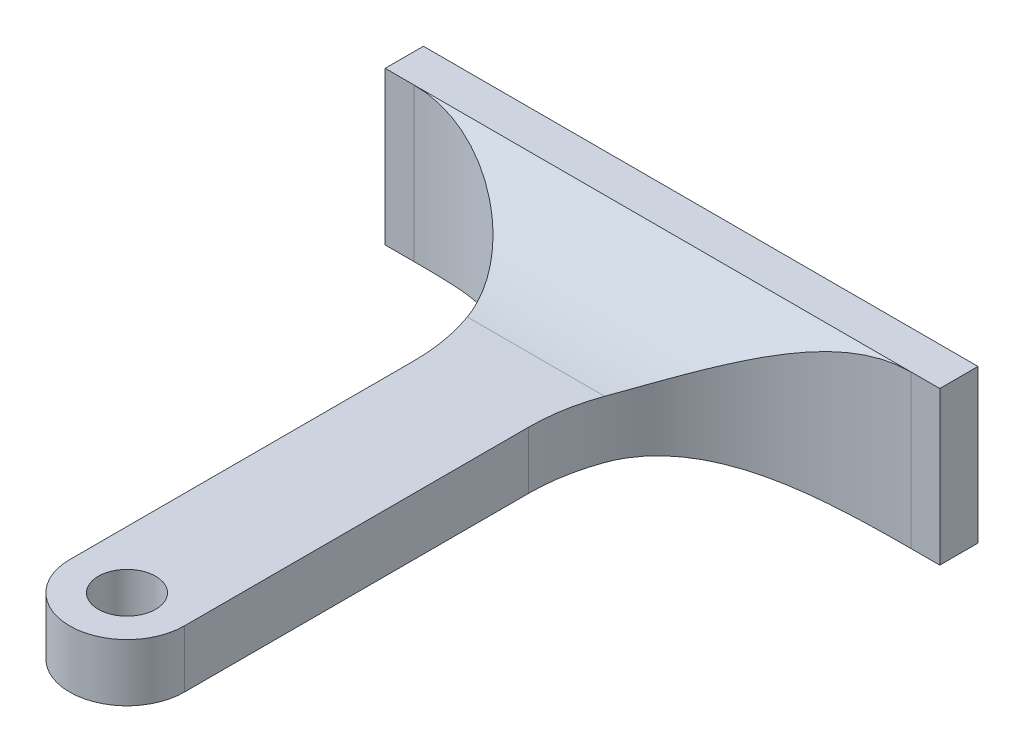
ISO-10303-21;
HEADER;
FILE_DESCRIPTION(('STEP AP214'),'2;1');
FILE_NAME('part.step','',(''),(''),'','','');
FILE_SCHEMA(('AUTOMOTIVE_DESIGN { 1 0 10303 214 1 1 1 1 }'));
ENDSEC;
DATA;
#1=APPLICATION_CONTEXT('core data for automotive mechanical design processes');
#2=APPLICATION_PROTOCOL_DEFINITION('international standard','automotive_design',2000,#1);
#3=PRODUCT_CONTEXT('',#1,'mechanical');
#4=PRODUCT('Part','Part','',(#3));
#5=PRODUCT_RELATED_PRODUCT_CATEGORY('part','',(#4));
#6=PRODUCT_DEFINITION_FORMATION('','',#4);
#7=PRODUCT_DEFINITION_CONTEXT('part definition',#1,'design');
#8=PRODUCT_DEFINITION('design','',#6,#7);
#9=PRODUCT_DEFINITION_SHAPE('','',#8);
#10=(LENGTH_UNIT() NAMED_UNIT(*) SI_UNIT(.MILLI.,.METRE.));
#11=(NAMED_UNIT(*) PLANE_ANGLE_UNIT() SI_UNIT($,.RADIAN.));
#12=(NAMED_UNIT(*) SI_UNIT($,.STERADIAN.) SOLID_ANGLE_UNIT());
#13=UNCERTAINTY_MEASURE_WITH_UNIT(LENGTH_MEASURE(1.E-05),#10,'distance_accuracy_value','');
#14=(GEOMETRIC_REPRESENTATION_CONTEXT(3) GLOBAL_UNCERTAINTY_ASSIGNED_CONTEXT((#13)) GLOBAL_UNIT_ASSIGNED_CONTEXT((#10,
#11,#12)) REPRESENTATION_CONTEXT('',''));
#15=CARTESIAN_POINT('',(0.,0.,0.));
#16=DIRECTION('',(0.,0.,1.));
#17=DIRECTION('',(1.,0.,0.));
#18=AXIS2_PLACEMENT_3D('',#15,#16,#17);
#19=CARTESIAN_POINT('',(0.,0.,2.));
#20=DIRECTION('',(0.,0.,-1.));
#21=DIRECTION('',(-1.,0.,0.));
#22=AXIS2_PLACEMENT_3D('',#19,#20,#21);
#23=PLANE('',#22);
#24=DIRECTION('',(1.,0.,0.));
#25=VECTOR('',#24,1.);
#26=CARTESIAN_POINT('',(-14.5,-4.,2.));
#27=LINE('',#26,#25);
#28=CARTESIAN_POINT('',(-14.5,-4.,2.));
#29=VERTEX_POINT('',#28);
#30=CARTESIAN_POINT('',(-13.,-4.,2.));
#31=VERTEX_POINT('',#30);
#32=EDGE_CURVE('E195',#29,#31,#27,.T.);
#33=ORIENTED_EDGE('',*,*,#32,.T.);
#34=DIRECTION('',(0.,-1.,0.));
#35=VECTOR('',#34,1.);
#36=CARTESIAN_POINT('',(-13.,1.5,2.));
#37=LINE('',#36,#35);
#38=CARTESIAN_POINT('',(-13.,4.,2.));
#39=VERTEX_POINT('',#38);
#40=EDGE_CURVE('E233',#31,#39,#37,.F.);
#41=ORIENTED_EDGE('',*,*,#40,.T.);
#42=DIRECTION('',(-1.,0.,0.));
#43=VECTOR('',#42,1.);
#44=CARTESIAN_POINT('',(-14.5,4.,2.));
#45=LINE('',#44,#43);
#46=CARTESIAN_POINT('',(-14.5,4.,2.));
#47=VERTEX_POINT('',#46);
#48=EDGE_CURVE('E191',#39,#47,#45,.T.);
#49=ORIENTED_EDGE('',*,*,#48,.T.);
#50=DIRECTION('',(0.,-1.,0.));
#51=VECTOR('',#50,1.);
#52=CARTESIAN_POINT('',(-14.5,4.,2.));
#53=LINE('',#52,#51);
#54=EDGE_CURVE('E189',#47,#29,#53,.T.);
#55=ORIENTED_EDGE('',*,*,#54,.T.);
#56=EDGE_LOOP('',(#33,#41,#49,#55));
#57=FACE_BOUND('',#56,.T.);
#58=ADVANCED_FACE('F39',(#57),#23,.F.);
#59=CARTESIAN_POINT('',(-14.5,4.,2.));
#60=DIRECTION('',(0.,-1.,0.));
#61=DIRECTION('',(0.,0.,-1.));
#62=AXIS2_PLACEMENT_3D('',#59,#60,#61);
#63=PLANE('',#62);
#64=DIRECTION('',(-1.,0.,0.));
#65=VECTOR('',#64,1.);
#66=CARTESIAN_POINT('',(-14.5,4.,0.));
#67=LINE('',#66,#65);
#68=CARTESIAN_POINT('',(14.5,4.,0.));
#69=VERTEX_POINT('',#68);
#70=CARTESIAN_POINT('',(-14.5,4.,0.));
#71=VERTEX_POINT('',#70);
#72=EDGE_CURVE('E175',#69,#71,#67,.T.);
#73=ORIENTED_EDGE('',*,*,#72,.T.);
#74=DIRECTION('',(0.,0.,-1.));
#75=VECTOR('',#74,1.);
#76=CARTESIAN_POINT('',(-14.5,4.,2.));
#77=LINE('',#76,#75);
#78=EDGE_CURVE('E223',#47,#71,#77,.T.);
#79=ORIENTED_EDGE('',*,*,#78,.F.);
#80=ORIENTED_EDGE('',*,*,#48,.F.);
#81=CARTESIAN_POINT('',(13.,4.,2.));
#82=VERTEX_POINT('',#81);
#83=EDGE_CURVE('E190',#82,#39,#45,.T.);
#84=ORIENTED_EDGE('',*,*,#83,.F.);
#85=CARTESIAN_POINT('',(14.5,4.,2.));
#86=VERTEX_POINT('',#85);
#87=EDGE_CURVE('E185',#86,#82,#45,.T.);
#88=ORIENTED_EDGE('',*,*,#87,.F.);
#89=DIRECTION('',(0.,0.,-1.));
#90=VECTOR('',#89,1.);
#91=CARTESIAN_POINT('',(14.5,4.,2.));
#92=LINE('',#91,#90);
#93=EDGE_CURVE('E202',#86,#69,#92,.T.);
#94=ORIENTED_EDGE('',*,*,#93,.T.);
#95=EDGE_LOOP('',(#73,#79,#80,#84,#88,#94));
#96=FACE_BOUND('',#95,.T.);
#97=ADVANCED_FACE('F324',(#96),#63,.F.);
#98=CARTESIAN_POINT('',(-14.5,4.,2.));
#99=DIRECTION('',(1.,0.,0.));
#100=DIRECTION('',(0.,1.,0.));
#101=AXIS2_PLACEMENT_3D('',#98,#99,#100);
#102=PLANE('',#101);
#103=DIRECTION('',(0.,-1.,0.));
#104=VECTOR('',#103,1.);
#105=CARTESIAN_POINT('',(-14.5,4.,0.));
#106=LINE('',#105,#104);
#107=CARTESIAN_POINT('',(-14.5,-4.,0.));
#108=VERTEX_POINT('',#107);
#109=EDGE_CURVE('E180',#71,#108,#106,.T.);
#110=ORIENTED_EDGE('',*,*,#109,.T.);
#111=DIRECTION('',(0.,0.,-1.));
#112=VECTOR('',#111,1.);
#113=CARTESIAN_POINT('',(-14.5,-4.,2.));
#114=LINE('',#113,#112);
#115=EDGE_CURVE('E219',#29,#108,#114,.T.);
#116=ORIENTED_EDGE('',*,*,#115,.F.);
#117=ORIENTED_EDGE('',*,*,#54,.F.);
#118=ORIENTED_EDGE('',*,*,#78,.T.);
#119=EDGE_LOOP('',(#110,#116,#117,#118));
#120=FACE_BOUND('',#119,.T.);
#121=ADVANCED_FACE('F331',(#120),#102,.F.);
#122=CARTESIAN_POINT('',(-14.5,-4.,2.));
#123=DIRECTION('',(0.,1.,0.));
#124=DIRECTION('',(-1.,0.,0.));
#125=AXIS2_PLACEMENT_3D('',#122,#123,#124);
#126=PLANE('',#125);
#127=DIRECTION('',(1.,0.,0.));
#128=VECTOR('',#127,1.);
#129=CARTESIAN_POINT('',(-14.5,-4.,0.));
#130=LINE('',#129,#128);
#131=CARTESIAN_POINT('',(14.5,-4.,0.));
#132=VERTEX_POINT('',#131);
#133=EDGE_CURVE('E206',#108,#132,#130,.T.);
#134=ORIENTED_EDGE('',*,*,#133,.T.);
#135=DIRECTION('',(0.,0.,-1.));
#136=VECTOR('',#135,1.);
#137=CARTESIAN_POINT('',(14.5,-4.,2.));
#138=LINE('',#137,#136);
#139=CARTESIAN_POINT('',(14.5,-4.,2.));
#140=VERTEX_POINT('',#139);
#141=EDGE_CURVE('E215',#140,#132,#138,.T.);
#142=ORIENTED_EDGE('',*,*,#141,.F.);
#143=CARTESIAN_POINT('',(13.,-4.,2.));
#144=VERTEX_POINT('',#143);
#145=EDGE_CURVE('E194',#144,#140,#27,.T.);
#146=ORIENTED_EDGE('',*,*,#145,.F.);
#147=EDGE_CURVE('E200',#31,#144,#27,.T.);
#148=ORIENTED_EDGE('',*,*,#147,.F.);
#149=ORIENTED_EDGE('',*,*,#32,.F.);
#150=ORIENTED_EDGE('',*,*,#115,.T.);
#151=EDGE_LOOP('',(#134,#142,#146,#148,#149,#150));
#152=FACE_BOUND('',#151,.T.);
#153=ADVANCED_FACE('F343',(#152),#126,.F.);
#154=CARTESIAN_POINT('',(14.5,4.,2.));
#155=DIRECTION('',(-1.,0.,0.));
#156=DIRECTION('',(0.,-1.,0.));
#157=AXIS2_PLACEMENT_3D('',#154,#155,#156);
#158=PLANE('',#157);
#159=DIRECTION('',(0.,1.,0.));
#160=VECTOR('',#159,1.);
#161=CARTESIAN_POINT('',(14.5,4.,0.));
#162=LINE('',#161,#160);
#163=EDGE_CURVE('E209',#132,#69,#162,.T.);
#164=ORIENTED_EDGE('',*,*,#163,.T.);
#165=ORIENTED_EDGE('',*,*,#93,.F.);
#166=DIRECTION('',(0.,1.,0.));
#167=VECTOR('',#166,1.);
#168=CARTESIAN_POINT('',(14.5,4.,2.));
#169=LINE('',#168,#167);
#170=EDGE_CURVE('E199',#140,#86,#169,.T.);
#171=ORIENTED_EDGE('',*,*,#170,.F.);
#172=ORIENTED_EDGE('',*,*,#141,.T.);
#173=EDGE_LOOP('',(#164,#165,#171,#172));
#174=FACE_BOUND('',#173,.T.);
#175=ADVANCED_FACE('F336',(#174),#158,.F.);
#176=ORIENTED_EDGE('',*,*,#87,.T.);
#177=DIRECTION('',(0.,-1.,0.));
#178=VECTOR('',#177,1.);
#179=CARTESIAN_POINT('',(13.,-1.5,2.));
#180=LINE('',#179,#178);
#181=EDGE_CURVE('E230',#82,#144,#180,.T.);
#182=ORIENTED_EDGE('',*,*,#181,.T.);
#183=ORIENTED_EDGE('',*,*,#145,.T.);
#184=ORIENTED_EDGE('',*,*,#170,.T.);
#185=EDGE_LOOP('',(#176,#182,#183,#184));
#186=FACE_BOUND('',#185,.T.);
#187=ADVANCED_FACE('F327',(#186),#23,.F.);
#188=CARTESIAN_POINT('',(0.,0.,0.));
#189=DIRECTION('',(0.,0.,-1.));
#190=DIRECTION('',(-1.,0.,0.));
#191=AXIS2_PLACEMENT_3D('',#188,#189,#190);
#192=PLANE('',#191);
#193=ORIENTED_EDGE('',*,*,#72,.F.);
#194=ORIENTED_EDGE('',*,*,#163,.F.);
#195=ORIENTED_EDGE('',*,*,#133,.F.);
#196=ORIENTED_EDGE('',*,*,#109,.F.);
#197=EDGE_LOOP('',(#193,#194,#195,#196));
#198=FACE_BOUND('',#197,.T.);
#199=ADVANCED_FACE('F269',(#198),#192,.T.);
#200=CARTESIAN_POINT('',(0.,1.5,30.));
#201=DIRECTION('',(0.,-1.,0.));
#202=DIRECTION('',(0.,0.,-1.));
#203=AXIS2_PLACEMENT_3D('',#200,#201,#202);
#204=PLANE('',#203);
#205=DIRECTION('',(0.,0.,-1.));
#206=VECTOR('',#205,1.);
#207=CARTESIAN_POINT('',(3.,1.5,2.));
#208=LINE('',#207,#206);
#209=CARTESIAN_POINT('',(3.,1.5,30.));
#210=VERTEX_POINT('',#209);
#211=CARTESIAN_POINT('',(3.,1.5,12.));
#212=VERTEX_POINT('',#211);
#213=EDGE_CURVE('E168',#210,#212,#208,.T.);
#214=ORIENTED_EDGE('',*,*,#213,.T.);
#215=CARTESIAN_POINT('',(13.,1.5,12.));
#216=DIRECTION('',(0.,-1.,0.));
#217=DIRECTION('',(0.,0.,-1.));
#218=AXIS2_PLACEMENT_3D('',#215,#216,#217);
#219=CIRCLE('',#218,10.);
#220=CARTESIAN_POINT('',(3.59055976408642,1.5,8.61437827766148));
#221=VERTEX_POINT('',#220);
#222=EDGE_CURVE('E68',#212,#221,#219,.T.);
#223=ORIENTED_EDGE('',*,*,#222,.T.);
#224=CARTESIAN_POINT('',(3.59055976408642,1.5,8.61437827766148));
#225=CARTESIAN_POINT('',(3.,1.5,8.61437827766148));
#226=B_SPLINE_CURVE_WITH_KNOTS('',1,(#224,#225),.UNSPECIFIED.,.F.,.F.,(2,2),(0.,1.),.UNSPECIFIED.);
#227=CARTESIAN_POINT('',(3.,1.5,8.61437827766147));
#228=VERTEX_POINT('',#227);
#229=EDGE_CURVE('E256',#221,#228,#226,.T.);
#230=ORIENTED_EDGE('',*,*,#229,.T.);
#231=DIRECTION('',(-1.,0.,0.));
#232=VECTOR('',#231,1.);
#233=CARTESIAN_POINT('',(0.,1.5,8.61437827766148));
#234=LINE('',#233,#232);
#235=CARTESIAN_POINT('',(-3.,1.5,8.61437827766148));
#236=VERTEX_POINT('',#235);
#237=EDGE_CURVE('E237',#228,#236,#234,.T.);
#238=ORIENTED_EDGE('',*,*,#237,.T.);
#239=CARTESIAN_POINT('',(-3.,1.5,8.61437827766148));
#240=CARTESIAN_POINT('',(-3.59055976408642,1.5,8.61437827766148));
#241=B_SPLINE_CURVE_WITH_KNOTS('',1,(#239,#240),.UNSPECIFIED.,.F.,.F.,(2,2),(0.,1.),.UNSPECIFIED.);
#242=CARTESIAN_POINT('',(-3.59055976408642,1.5,8.61437827766148));
#243=VERTEX_POINT('',#242);
#244=EDGE_CURVE('E251',#236,#243,#241,.T.);
#245=ORIENTED_EDGE('',*,*,#244,.T.);
#246=CARTESIAN_POINT('',(-13.,1.5,12.));
#247=DIRECTION('',(0.,-1.,0.));
#248=DIRECTION('',(0.,0.,-1.));
#249=AXIS2_PLACEMENT_3D('',#246,#247,#248);
#250=CIRCLE('',#249,10.);
#251=CARTESIAN_POINT('',(-3.,1.5,12.));
#252=VERTEX_POINT('',#251);
#253=EDGE_CURVE('E152',#243,#252,#250,.T.);
#254=ORIENTED_EDGE('',*,*,#253,.T.);
#255=DIRECTION('',(0.,0.,1.));
#256=VECTOR('',#255,1.);
#257=CARTESIAN_POINT('',(-3.,1.5,30.));
#258=LINE('',#257,#256);
#259=CARTESIAN_POINT('',(-3.,1.5,30.));
#260=VERTEX_POINT('',#259);
#261=EDGE_CURVE('E145',#252,#260,#258,.T.);
#262=ORIENTED_EDGE('',*,*,#261,.T.);
#263=CARTESIAN_POINT('',(0.,1.5,30.));
#264=DIRECTION('',(0.,1.,0.));
#265=DIRECTION('',(0.,0.,-1.));
#266=AXIS2_PLACEMENT_3D('',#263,#264,#265);
#267=CIRCLE('',#266,3.);
#268=EDGE_CURVE('E149',#260,#210,#267,.T.);
#269=ORIENTED_EDGE('',*,*,#268,.T.);
#270=EDGE_LOOP('',(#214,#223,#230,#238,#245,#254,#262,#269));
#271=FACE_BOUND('',#270,.T.);
#272=CARTESIAN_POINT('',(0.,1.5,30.));
#273=DIRECTION('',(0.,1.,0.));
#274=DIRECTION('',(0.,0.,1.));
#275=AXIS2_PLACEMENT_3D('',#272,#273,#274);
#276=CIRCLE('',#275,1.5);
#277=CARTESIAN_POINT('',(0.,1.5,31.5));
#278=VERTEX_POINT('',#277);
#279=EDGE_CURVE('E364',#278,#278,#276,.T.);
#280=ORIENTED_EDGE('',*,*,#279,.F.);
#281=EDGE_LOOP('',(#280));
#282=FACE_BOUND('',#281,.T.);
#283=ADVANCED_FACE('F147',(#271,#282),#204,.F.);
#284=CARTESIAN_POINT('',(0.,-1.5,30.));
#285=DIRECTION('',(0.,-1.,0.));
#286=DIRECTION('',(0.,0.,-1.));
#287=AXIS2_PLACEMENT_3D('',#284,#285,#286);
#288=PLANE('',#287);
#289=CARTESIAN_POINT('',(-13.,-1.5,12.));
#290=DIRECTION('',(0.,-1.,0.));
#291=DIRECTION('',(0.,0.,-1.));
#292=AXIS2_PLACEMENT_3D('',#289,#290,#291);
#293=CIRCLE('',#292,10.);
#294=CARTESIAN_POINT('',(-3.,-1.5,12.));
#295=VERTEX_POINT('',#294);
#296=CARTESIAN_POINT('',(-3.59055976408642,-1.5,8.61437827766148));
#297=VERTEX_POINT('',#296);
#298=EDGE_CURVE('E246',#295,#297,#293,.F.);
#299=ORIENTED_EDGE('',*,*,#298,.T.);
#300=CARTESIAN_POINT('',(-3.59055976408642,-1.5,8.61437827766148));
#301=CARTESIAN_POINT('',(-3.,-1.5,8.61437827766148));
#302=B_SPLINE_CURVE_WITH_KNOTS('',1,(#300,#301),.UNSPECIFIED.,.F.,.F.,(2,2),(0.,1.),.UNSPECIFIED.);
#303=CARTESIAN_POINT('',(-3.,-1.5,8.61437827766148));
#304=VERTEX_POINT('',#303);
#305=EDGE_CURVE('E54',#297,#304,#302,.T.);
#306=ORIENTED_EDGE('',*,*,#305,.T.);
#307=DIRECTION('',(-1.,0.,0.));
#308=VECTOR('',#307,1.);
#309=CARTESIAN_POINT('',(3.,-1.5,8.61437827766148));
#310=LINE('',#309,#308);
#311=CARTESIAN_POINT('',(3.,-1.5,8.61437827766147));
#312=VERTEX_POINT('',#311);
#313=EDGE_CURVE('E243',#304,#312,#310,.F.);
#314=ORIENTED_EDGE('',*,*,#313,.T.);
#315=CARTESIAN_POINT('',(3.,-1.5,8.61437827766148));
#316=CARTESIAN_POINT('',(3.59055976408642,-1.5,8.61437827766148));
#317=B_SPLINE_CURVE_WITH_KNOTS('',1,(#315,#316),.UNSPECIFIED.,.F.,.F.,(2,2),(0.,1.),.UNSPECIFIED.);
#318=CARTESIAN_POINT('',(3.59055976408642,-1.5,8.61437827766148));
#319=VERTEX_POINT('',#318);
#320=EDGE_CURVE('E11',#312,#319,#317,.T.);
#321=ORIENTED_EDGE('',*,*,#320,.T.);
#322=CARTESIAN_POINT('',(13.,-1.5,12.));
#323=DIRECTION('',(0.,-1.,0.));
#324=DIRECTION('',(0.,0.,-1.));
#325=AXIS2_PLACEMENT_3D('',#322,#323,#324);
#326=CIRCLE('',#325,10.);
#327=CARTESIAN_POINT('',(3.,-1.5,12.));
#328=VERTEX_POINT('',#327);
#329=EDGE_CURVE('E375',#319,#328,#326,.F.);
#330=ORIENTED_EDGE('',*,*,#329,.T.);
#331=DIRECTION('',(0.,0.,-1.));
#332=VECTOR('',#331,1.);
#333=CARTESIAN_POINT('',(3.,-1.5,2.));
#334=LINE('',#333,#332);
#335=CARTESIAN_POINT('',(3.,-1.5,30.));
#336=VERTEX_POINT('',#335);
#337=EDGE_CURVE('E158',#336,#328,#334,.T.);
#338=ORIENTED_EDGE('',*,*,#337,.F.);
#339=CARTESIAN_POINT('',(0.,-1.5,30.));
#340=DIRECTION('',(0.,1.,0.));
#341=DIRECTION('',(0.,0.,-1.));
#342=AXIS2_PLACEMENT_3D('',#339,#340,#341);
#343=CIRCLE('',#342,3.);
#344=CARTESIAN_POINT('',(-3.,-1.5,30.));
#345=VERTEX_POINT('',#344);
#346=EDGE_CURVE('E384',#345,#336,#343,.T.);
#347=ORIENTED_EDGE('',*,*,#346,.F.);
#348=DIRECTION('',(0.,0.,1.));
#349=VECTOR('',#348,1.);
#350=CARTESIAN_POINT('',(-3.,-1.5,30.));
#351=LINE('',#350,#349);
#352=EDGE_CURVE('E172',#295,#345,#351,.T.);
#353=ORIENTED_EDGE('',*,*,#352,.F.);
#354=EDGE_LOOP('',(#299,#306,#314,#321,#330,#338,#347,#353));
#355=FACE_BOUND('',#354,.T.);
#356=CARTESIAN_POINT('',(0.,-1.5,30.));
#357=DIRECTION('',(0.,1.,0.));
#358=DIRECTION('',(0.,0.,1.));
#359=AXIS2_PLACEMENT_3D('',#356,#357,#358);
#360=CIRCLE('',#359,1.5);
#361=CARTESIAN_POINT('',(0.,-1.5,31.5));
#362=VERTEX_POINT('',#361);
#363=EDGE_CURVE('E360',#362,#362,#360,.T.);
#364=ORIENTED_EDGE('',*,*,#363,.T.);
#365=EDGE_LOOP('',(#364));
#366=FACE_BOUND('',#365,.T.);
#367=ADVANCED_FACE('F268',(#355,#366),#288,.T.);
#368=CARTESIAN_POINT('',(-3.,1.5,30.));
#369=DIRECTION('',(1.,0.,0.));
#370=DIRECTION('',(0.,0.,-1.));
#371=AXIS2_PLACEMENT_3D('',#368,#369,#370);
#372=PLANE('',#371);
#373=ORIENTED_EDGE('',*,*,#261,.F.);
#374=DIRECTION('',(0.,-1.,0.));
#375=VECTOR('',#374,1.);
#376=CARTESIAN_POINT('',(-3.,-1.5,12.));
#377=LINE('',#376,#375);
#378=EDGE_CURVE('E227',#252,#295,#377,.T.);
#379=ORIENTED_EDGE('',*,*,#378,.T.);
#380=ORIENTED_EDGE('',*,*,#352,.T.);
#381=DIRECTION('',(0.,-1.,0.));
#382=VECTOR('',#381,1.);
#383=CARTESIAN_POINT('',(-3.,1.5,30.));
#384=LINE('',#383,#382);
#385=EDGE_CURVE('E163',#260,#345,#384,.T.);
#386=ORIENTED_EDGE('',*,*,#385,.F.);
#387=EDGE_LOOP('',(#373,#379,#380,#386));
#388=FACE_BOUND('',#387,.T.);
#389=ADVANCED_FACE('F170',(#388),#372,.F.);
#390=CARTESIAN_POINT('',(0.,1.5,30.));
#391=DIRECTION('',(0.,-1.,0.));
#392=DIRECTION('',(0.,0.,-1.));
#393=AXIS2_PLACEMENT_3D('',#390,#391,#392);
#394=CYLINDRICAL_SURFACE('',#393,3.);
#395=ORIENTED_EDGE('',*,*,#346,.T.);
#396=DIRECTION('',(0.,-1.,0.));
#397=VECTOR('',#396,1.);
#398=CARTESIAN_POINT('',(3.,1.5,30.));
#399=LINE('',#398,#397);
#400=EDGE_CURVE('E165',#210,#336,#399,.T.);
#401=ORIENTED_EDGE('',*,*,#400,.F.);
#402=ORIENTED_EDGE('',*,*,#268,.F.);
#403=ORIENTED_EDGE('',*,*,#385,.T.);
#404=EDGE_LOOP('',(#395,#401,#402,#403));
#405=FACE_BOUND('',#404,.T.);
#406=ADVANCED_FACE('F162',(#405),#394,.T.);
#407=CARTESIAN_POINT('',(3.,1.5,2.));
#408=DIRECTION('',(-1.,0.,0.));
#409=DIRECTION('',(0.,0.,1.));
#410=AXIS2_PLACEMENT_3D('',#407,#408,#409);
#411=PLANE('',#410);
#412=ORIENTED_EDGE('',*,*,#337,.T.);
#413=DIRECTION('',(0.,-1.,0.));
#414=VECTOR('',#413,1.);
#415=CARTESIAN_POINT('',(3.,1.5,12.));
#416=LINE('',#415,#414);
#417=EDGE_CURVE('E240',#328,#212,#416,.F.);
#418=ORIENTED_EDGE('',*,*,#417,.T.);
#419=ORIENTED_EDGE('',*,*,#213,.F.);
#420=ORIENTED_EDGE('',*,*,#400,.T.);
#421=EDGE_LOOP('',(#412,#418,#419,#420));
#422=FACE_BOUND('',#421,.T.);
#423=ADVANCED_FACE('F275',(#422),#411,.F.);
#424=CARTESIAN_POINT('',(0.,1.5,30.));
#425=DIRECTION('',(0.,-1.,0.));
#426=DIRECTION('',(0.,0.,-1.));
#427=AXIS2_PLACEMENT_3D('',#424,#425,#426);
#428=CYLINDRICAL_SURFACE('',#427,1.5);
#429=ORIENTED_EDGE('',*,*,#279,.T.);
#430=EDGE_LOOP('',(#429));
#431=FACE_BOUND('',#430,.T.);
#432=ORIENTED_EDGE('',*,*,#363,.F.);
#433=EDGE_LOOP('',(#432));
#434=FACE_BOUND('',#433,.T.);
#435=ADVANCED_FACE('F270',(#431,#434),#428,.F.);
#436=CARTESIAN_POINT('',(13.,0.,12.));
#437=DIRECTION('',(0.,1.,0.));
#438=DIRECTION('',(0.,0.,1.));
#439=AXIS2_PLACEMENT_3D('',#436,#437,#438);
#440=CYLINDRICAL_SURFACE('',#439,10.);
#441=CARTESIAN_POINT('',(13.,-4.,2.));
#442=CARTESIAN_POINT('',(12.8738207621259,-4.00000849098867,1.99999782559541));
#443=CARTESIAN_POINT('',(12.7476637586308,-3.99789251808952,2.00238884765917));
#444=CARTESIAN_POINT('',(12.4956848762007,-3.98949219192198,2.01192930975726));
#445=CARTESIAN_POINT('',(12.3698629556587,-3.98320838296141,2.019078128437));
#446=CARTESIAN_POINT('',(11.993760384992,-3.95825660448758,2.04758433123197));
#447=CARTESIAN_POINT('',(11.7443642909698,-3.93348768005123,2.07600169655883));
#448=CARTESIAN_POINT('',(11.253053807939,-3.86961154738112,2.15067010285417));
#449=CARTESIAN_POINT('',(11.0110874030821,-3.83066427192338,2.19672250896862));
#450=CARTESIAN_POINT('',(10.5332915939441,-3.74060603619868,2.30590737371302));
#451=CARTESIAN_POINT('',(10.2974645431265,-3.68949048534371,2.36904627960667));
#452=CARTESIAN_POINT('',(9.83462315393597,-3.57797637032648,2.51113135016687));
#453=CARTESIAN_POINT('',(9.60756255426749,-3.51763849001654,2.58997513530608));
#454=CARTESIAN_POINT('',(9.16148441574416,-3.38998192222703,2.76295221841499));
#455=CARTESIAN_POINT('',(8.94246623740899,-3.32266379140562,2.8570842975186));
#456=CARTESIAN_POINT('',(8.29626360534686,-3.11326898633487,3.16244170229346));
#457=CARTESIAN_POINT('',(7.88162189881637,-2.96419288697743,3.39610328249312));
#458=CARTESIAN_POINT('',(7.25436603382632,-2.72755497670578,3.81068877572391));
#459=CARTESIAN_POINT('',(7.0292540044609,-2.64010954453042,3.97332415979801));
#460=CARTESIAN_POINT('',(6.59253500678366,-2.46820510807735,4.31744630126427));
#461=CARTESIAN_POINT('',(6.38092952734328,-2.38374643349581,4.4989351311598));
#462=CARTESIAN_POINT('',(5.97313552419569,-2.22132583940474,4.87955809441662));
#463=CARTESIAN_POINT('',(5.77689253207654,-2.14334090140013,5.07862401312955));
#464=CARTESIAN_POINT('',(5.4002568861323,-1.99660836750138,5.49442172920665));
#465=CARTESIAN_POINT('',(5.21986267420222,-1.92785986321433,5.71115178594932));
#466=CARTESIAN_POINT('',(4.89652056351433,-1.80999657097285,6.1351736405994));
#467=CARTESIAN_POINT('',(4.75165807478822,-1.7595278836498,6.34062752255075));
#468=CARTESIAN_POINT('',(4.47685825193675,-1.6703812106173,6.76362397571759));
#469=CARTESIAN_POINT('',(4.34691450210508,-1.63169814465302,6.98116129035904));
#470=CARTESIAN_POINT('',(4.10203539404733,-1.56787746065088,7.42922740917329));
#471=CARTESIAN_POINT('',(3.98725200692943,-1.54287010557159,7.65985881067476));
#472=CARTESIAN_POINT('',(3.82836362213157,-1.51741192646398,8.01279584684753));
#473=CARTESIAN_POINT('',(3.77757571237363,-1.51093429053995,8.13171629901361));
#474=CARTESIAN_POINT('',(3.680590661296,-1.50222696590505,8.37159071169086));
#475=CARTESIAN_POINT('',(3.63439432689902,-1.499998022612,8.49254502528106));
#476=CARTESIAN_POINT('',(3.59055976408642,-1.5,8.61437827766147));
#477=B_SPLINE_CURVE_WITH_KNOTS('',3,(#441,#442,#443,#444,#445,#446,#447,#448,#449,#450,#451,
#452,#453,#454,#455,#456,#457,#458,#459,#460,#461,#462,#463,#464,#465,#466,#467,#468,#469,#470,
#471,#472,#473,#474,#475,#476),.UNSPECIFIED.,.F.,.F.,(4,2,2,2,2,2,2,2,2,2,2,2,2,2,2,2,2,4),(0.,
0.378454215177601,0.756859015016274,1.51223922499202,2.25935011752832,3.00674331208636,
3.74941497412285,4.49202745536721,5.98267706131774,6.85542240186276,7.72826378243956,
8.59785531651544,9.46736126453422,10.2356553970855,11.003617882271,11.7787732622633,
12.1670479319625,12.5553907167868),.UNSPECIFIED.);
#478=EDGE_CURVE('E354',#144,#319,#477,.T.);
#479=ORIENTED_EDGE('',*,*,#478,.F.);
#480=ORIENTED_EDGE('',*,*,#181,.F.);
#481=CARTESIAN_POINT('',(13.,4.,2.));
#482=CARTESIAN_POINT('',(12.8738207621259,4.00000849098867,1.99999782559541));
#483=CARTESIAN_POINT('',(12.7476637586308,3.99789251808952,2.00238884765917));
#484=CARTESIAN_POINT('',(12.4956848762007,3.98949219192198,2.01192930975726));
#485=CARTESIAN_POINT('',(12.3698629556587,3.98320838296141,2.019078128437));
#486=CARTESIAN_POINT('',(11.993760384992,3.95825660448758,2.04758433123197));
#487=CARTESIAN_POINT('',(11.7443642909698,3.93348768005123,2.07600169655883));
#488=CARTESIAN_POINT('',(11.253053807939,3.86961154738112,2.15067010285417));
#489=CARTESIAN_POINT('',(11.0110874030821,3.83066427192338,2.19672250896862));
#490=CARTESIAN_POINT('',(10.5332915939441,3.74060603619868,2.30590737371302));
#491=CARTESIAN_POINT('',(10.2974645431265,3.68949048534371,2.36904627960667));
#492=CARTESIAN_POINT('',(9.83462315393597,3.57797637032648,2.51113135016687));
#493=CARTESIAN_POINT('',(9.60756255426749,3.51763849001654,2.58997513530608));
#494=CARTESIAN_POINT('',(9.16148441574416,3.38998192222703,2.76295221841499));
#495=CARTESIAN_POINT('',(8.94246623740899,3.32266379140562,2.8570842975186));
#496=CARTESIAN_POINT('',(8.29626360534686,3.11326898633487,3.16244170229346));
#497=CARTESIAN_POINT('',(7.88162189881637,2.96419288697743,3.39610328249312));
#498=CARTESIAN_POINT('',(7.25436603382632,2.72755497670578,3.81068877572391));
#499=CARTESIAN_POINT('',(7.0292540044609,2.64010954453042,3.97332415979801));
#500=CARTESIAN_POINT('',(6.59253500678366,2.46820510807735,4.31744630126427));
#501=CARTESIAN_POINT('',(6.38092952734328,2.38374643349581,4.4989351311598));
#502=CARTESIAN_POINT('',(5.97313552419569,2.22132583940474,4.87955809441662));
#503=CARTESIAN_POINT('',(5.77689253207654,2.14334090140013,5.07862401312955));
#504=CARTESIAN_POINT('',(5.4002568861323,1.99660836750138,5.49442172920665));
#505=CARTESIAN_POINT('',(5.21986267420222,1.92785986321433,5.71115178594932));
#506=CARTESIAN_POINT('',(4.89652056351433,1.80999657097285,6.1351736405994));
#507=CARTESIAN_POINT('',(4.75165807478822,1.7595278836498,6.34062752255075));
#508=CARTESIAN_POINT('',(4.47685825193675,1.6703812106173,6.76362397571759));
#509=CARTESIAN_POINT('',(4.34691450210508,1.63169814465302,6.98116129035904));
#510=CARTESIAN_POINT('',(4.10203539404733,1.56787746065088,7.42922740917329));
#511=CARTESIAN_POINT('',(3.98725200692943,1.54287010557159,7.65985881067476));
#512=CARTESIAN_POINT('',(3.82836362213157,1.51741192646398,8.01279584684753));
#513=CARTESIAN_POINT('',(3.77757571237363,1.51093429053995,8.13171629901361));
#514=CARTESIAN_POINT('',(3.680590661296,1.50222696590505,8.37159071169086));
#515=CARTESIAN_POINT('',(3.63439432689902,1.499998022612,8.49254502528106));
#516=CARTESIAN_POINT('',(3.59055976408642,1.5,8.61437827766147));
#517=B_SPLINE_CURVE_WITH_KNOTS('',3,(#481,#482,#483,#484,#485,#486,#487,#488,#489,#490,#491,
#492,#493,#494,#495,#496,#497,#498,#499,#500,#501,#502,#503,#504,#505,#506,#507,#508,#509,#510,
#511,#512,#513,#514,#515,#516),.UNSPECIFIED.,.F.,.F.,(4,2,2,2,2,2,2,2,2,2,2,2,2,2,2,2,2,4),(0.,
0.378454215177601,0.756859015016274,1.51223922499202,2.25935011752832,3.00674331208636,
3.74941497412285,4.49202745536721,5.98267706131774,6.85542240186276,7.72826378243956,
8.59785531651544,9.46736126453422,10.2356553970855,11.003617882271,11.7787732622633,
12.1670479319625,12.5553907167868),.UNSPECIFIED.);
#518=EDGE_CURVE('E44',#221,#82,#517,.F.);
#519=ORIENTED_EDGE('',*,*,#518,.F.);
#520=ORIENTED_EDGE('',*,*,#222,.F.);
#521=ORIENTED_EDGE('',*,*,#417,.F.);
#522=ORIENTED_EDGE('',*,*,#329,.F.);
#523=EDGE_LOOP('',(#479,#480,#519,#520,#521,#522));
#524=FACE_BOUND('',#523,.T.);
#525=ADVANCED_FACE('F41',(#524),#440,.F.);
#526=CARTESIAN_POINT('',(0.,11.5,8.61437827766148));
#527=DIRECTION('',(-1.,0.,0.));
#528=DIRECTION('',(0.,0.,1.));
#529=AXIS2_PLACEMENT_3D('',#526,#527,#528);
#530=CYLINDRICAL_SURFACE('',#529,10.);
#531=ORIENTED_EDGE('',*,*,#518,.T.);
#532=ORIENTED_EDGE('',*,*,#83,.T.);
#533=CARTESIAN_POINT('',(-13.,4.,2.));
#534=CARTESIAN_POINT('',(-12.8738207621259,4.00000849098867,1.99999782559541));
#535=CARTESIAN_POINT('',(-12.7476637586308,3.99789251808952,2.00238884765917));
#536=CARTESIAN_POINT('',(-12.4956848762007,3.98949219192198,2.01192930975726));
#537=CARTESIAN_POINT('',(-12.3698629556587,3.98320838296141,2.019078128437));
#538=CARTESIAN_POINT('',(-11.993760384992,3.95825660448758,2.04758433123197));
#539=CARTESIAN_POINT('',(-11.7443642909698,3.93348768005123,2.07600169655883));
#540=CARTESIAN_POINT('',(-11.253053807939,3.86961154738112,2.15067010285417));
#541=CARTESIAN_POINT('',(-11.0110874030821,3.83066427192338,2.19672250896862));
#542=CARTESIAN_POINT('',(-10.5332915939441,3.74060603619868,2.30590737371302));
#543=CARTESIAN_POINT('',(-10.2974645431265,3.68949048534371,2.36904627960667));
#544=CARTESIAN_POINT('',(-9.83462315393597,3.57797637032648,2.51113135016687));
#545=CARTESIAN_POINT('',(-9.60756255426749,3.51763849001654,2.58997513530608));
#546=CARTESIAN_POINT('',(-9.16148441574416,3.38998192222703,2.76295221841499));
#547=CARTESIAN_POINT('',(-8.94246623740899,3.32266379140562,2.8570842975186));
#548=CARTESIAN_POINT('',(-8.29626360534686,3.11326898633487,3.16244170229346));
#549=CARTESIAN_POINT('',(-7.88162189881637,2.96419288697743,3.39610328249312));
#550=CARTESIAN_POINT('',(-7.25436603382632,2.72755497670578,3.81068877572391));
#551=CARTESIAN_POINT('',(-7.0292540044609,2.64010954453042,3.97332415979801));
#552=CARTESIAN_POINT('',(-6.59253500678366,2.46820510807735,4.31744630126427));
#553=CARTESIAN_POINT('',(-6.38092952734328,2.38374643349581,4.4989351311598));
#554=CARTESIAN_POINT('',(-5.97313552419569,2.22132583940474,4.87955809441662));
#555=CARTESIAN_POINT('',(-5.77689253207654,2.14334090140013,5.07862401312955));
#556=CARTESIAN_POINT('',(-5.4002568861323,1.99660836750138,5.49442172920665));
#557=CARTESIAN_POINT('',(-5.21986267420222,1.92785986321433,5.71115178594932));
#558=CARTESIAN_POINT('',(-4.89652056351433,1.80999657097285,6.1351736405994));
#559=CARTESIAN_POINT('',(-4.75165807478822,1.7595278836498,6.34062752255075));
#560=CARTESIAN_POINT('',(-4.47685825193675,1.6703812106173,6.76362397571759));
#561=CARTESIAN_POINT('',(-4.34691450210508,1.63169814465302,6.98116129035904));
#562=CARTESIAN_POINT('',(-4.10203539404733,1.56787746065088,7.42922740917329));
#563=CARTESIAN_POINT('',(-3.98725200692943,1.54287010557159,7.65985881067476));
#564=CARTESIAN_POINT('',(-3.82836362213157,1.51741192646398,8.01279584684753));
#565=CARTESIAN_POINT('',(-3.77757571237363,1.51093429053995,8.13171629901361));
#566=CARTESIAN_POINT('',(-3.680590661296,1.50222696590505,8.37159071169086));
#567=CARTESIAN_POINT('',(-3.63439432689902,1.499998022612,8.49254502528106));
#568=CARTESIAN_POINT('',(-3.59055976408642,1.5,8.61437827766147));
#569=B_SPLINE_CURVE_WITH_KNOTS('',3,(#533,#534,#535,#536,#537,#538,#539,#540,#541,#542,#543,
#544,#545,#546,#547,#548,#549,#550,#551,#552,#553,#554,#555,#556,#557,#558,#559,#560,#561,#562,
#563,#564,#565,#566,#567,#568),.UNSPECIFIED.,.F.,.F.,(4,2,2,2,2,2,2,2,2,2,2,2,2,2,2,2,2,4),(0.,
0.378454215177601,0.756859015016274,1.51223922499202,2.25935011752832,3.00674331208636,
3.74941497412285,4.49202745536721,5.98267706131774,6.85542240186276,7.72826378243956,
8.59785531651544,9.46736126453422,10.2356553970855,11.003617882271,11.7787732622633,
12.1670479319625,12.5553907167868),.UNSPECIFIED.);
#570=EDGE_CURVE('E298',#243,#39,#569,.F.);
#571=ORIENTED_EDGE('',*,*,#570,.F.);
#572=ORIENTED_EDGE('',*,*,#244,.F.);
#573=ORIENTED_EDGE('',*,*,#237,.F.);
#574=ORIENTED_EDGE('',*,*,#229,.F.);
#575=EDGE_LOOP('',(#531,#532,#571,#572,#573,#574));
#576=FACE_BOUND('',#575,.T.);
#577=ADVANCED_FACE('F310',(#576),#530,.F.);
#578=CARTESIAN_POINT('',(0.,-11.5,8.61437827766148));
#579=DIRECTION('',(1.,0.,0.));
#580=DIRECTION('',(0.,1.,0.));
#581=AXIS2_PLACEMENT_3D('',#578,#579,#580);
#582=CYLINDRICAL_SURFACE('',#581,10.);
#583=ORIENTED_EDGE('',*,*,#313,.F.);
#584=ORIENTED_EDGE('',*,*,#305,.F.);
#585=CARTESIAN_POINT('',(-3.59055976408642,-1.5,8.61437827766148));
#586=CARTESIAN_POINT('',(-3.63344272959679,-1.49999819660341,8.49519033431469));
#587=CARTESIAN_POINT('',(-3.67858601136991,-1.5021312992637,8.37684294013145));
#588=CARTESIAN_POINT('',(-3.77327112400644,-1.51046898469621,8.14208786653972));
#589=CARTESIAN_POINT('',(-3.82281223832919,-1.51667290525736,8.02567987480094));
#590=CARTESIAN_POINT('',(-3.97770423648963,-1.54106826665852,7.68006781312463));
#591=CARTESIAN_POINT('',(-4.08946313724318,-1.56504460108847,7.45408890552313));
#592=CARTESIAN_POINT('',(-4.32761714818699,-1.62628395474469,7.01485976939695));
#593=CARTESIAN_POINT('',(-4.4538581348196,-1.66341449825196,6.80150652484152));
#594=CARTESIAN_POINT('',(-4.72067330285004,-1.74907180042587,6.38629630405186));
#595=CARTESIAN_POINT('',(-4.8612521522097,-1.79760227730034,6.18444310542514));
#596=CARTESIAN_POINT('',(-5.15473670707772,-1.90377023857769,5.79426787747552));
#597=CARTESIAN_POINT('',(-5.30757085127054,-1.96135650620435,5.60587793177508));
#598=CARTESIAN_POINT('',(-5.62512831694146,-2.08382102372677,5.24207106322765));
#599=CARTESIAN_POINT('',(-5.78985065153271,-2.14869866858434,5.06665306596875));
#600=CARTESIAN_POINT('',(-6.30194658491143,-2.35192250368755,4.55906129483));
#601=CARTESIAN_POINT('',(-6.66626902039164,-2.49848371038101,4.24684369267909));
#602=CARTESIAN_POINT('',(-7.27008798687194,-2.73336494230542,3.79979772230326));
#603=CARTESIAN_POINT('',(-7.49668977351996,-2.81991459634844,3.64603996608877));
#604=CARTESIAN_POINT('',(-7.96221190366273,-2.99167124718548,3.35733548272485));
#605=CARTESIAN_POINT('',(-8.20113373332588,-3.07687808036857,3.22239103233302));
#606=CARTESIAN_POINT('',(-8.68965068215346,-3.2421856765529,2.97249194089943));
#607=CARTESIAN_POINT('',(-8.93920170966932,-3.32230464189875,2.85746316099156));
#608=CARTESIAN_POINT('',(-9.44915639348768,-3.47415023843163,2.64759408038962));
#609=CARTESIAN_POINT('',(-9.70955909004723,-3.54587760966043,2.55275199885643));
#610=CARTESIAN_POINT('',(-10.2136315498887,-3.67051580946585,2.39276907751915));
#611=CARTESIAN_POINT('',(-10.4563683089765,-3.72459130536338,2.32560584565048));
#612=CARTESIAN_POINT('',(-10.9485115385513,-3.82000745059236,2.20942893970992));
#613=CARTESIAN_POINT('',(-11.1979146865467,-3.86135431976683,2.1604063988163));
#614=CARTESIAN_POINT('',(-11.7044509065365,-3.92920788345107,2.08093305190703));
#615=CARTESIAN_POINT('',(-11.9616373216175,-3.9555562156074,2.05068013574891));
#616=CARTESIAN_POINT('',(-12.3496405514034,-3.98211447531275,2.02032362054036));
#617=CARTESIAN_POINT('',(-12.4794858735192,-3.98880671732628,2.01270851557355));
#618=CARTESIAN_POINT('',(-12.7395459529598,-3.99775464777777,2.00254508338764));
#619=CARTESIAN_POINT('',(-12.8697607622614,-4.00000967752186,1.999997508431));
#620=CARTESIAN_POINT('',(-13.,-4.,2.));
#621=B_SPLINE_CURVE_WITH_KNOTS('',3,(#585,#586,#587,#588,#589,#590,#591,#592,#593,#594,#595,
#596,#597,#598,#599,#600,#601,#602,#603,#604,#605,#606,#607,#608,#609,#610,#611,#612,#613,#614,
#615,#616,#617,#618,#619,#620),.UNSPECIFIED.,.F.,.F.,(4,2,2,2,2,2,2,2,2,2,2,2,2,2,2,2,2,4),(0.,
0.379914958230897,0.759768129975156,1.51824658785031,2.2692939681463,3.02058665138645,
3.76777371048428,4.51489881374545,6.01410051363977,6.87500760609063,7.73601879393613,
8.59375240980815,9.45141032636448,10.2232473855859,10.9947066857888,11.7741671702941,
12.1647352136616,12.5553612315753),.UNSPECIFIED.);
#622=EDGE_CURVE('E283',#31,#297,#621,.F.);
#623=ORIENTED_EDGE('',*,*,#622,.F.);
#624=ORIENTED_EDGE('',*,*,#147,.T.);
#625=ORIENTED_EDGE('',*,*,#478,.T.);
#626=ORIENTED_EDGE('',*,*,#320,.F.);
#627=EDGE_LOOP('',(#583,#584,#623,#624,#625,#626));
#628=FACE_BOUND('',#627,.T.);
#629=ADVANCED_FACE('F303',(#628),#582,.F.);
#630=CARTESIAN_POINT('',(-13.,1.5,12.));
#631=DIRECTION('',(0.,1.,0.));
#632=DIRECTION('',(0.,0.,1.));
#633=AXIS2_PLACEMENT_3D('',#630,#631,#632);
#634=CYLINDRICAL_SURFACE('',#633,10.);
#635=ORIENTED_EDGE('',*,*,#570,.T.);
#636=ORIENTED_EDGE('',*,*,#40,.F.);
#637=ORIENTED_EDGE('',*,*,#622,.T.);
#638=ORIENTED_EDGE('',*,*,#298,.F.);
#639=ORIENTED_EDGE('',*,*,#378,.F.);
#640=ORIENTED_EDGE('',*,*,#253,.F.);
#641=EDGE_LOOP('',(#635,#636,#637,#638,#639,#640));
#642=FACE_BOUND('',#641,.T.);
#643=ADVANCED_FACE('F306',(#642),#634,.F.);
#644=CLOSED_SHELL('',(#58,#97,#121,#153,#175,#187,#199,#283,#367,#389,#406,#423,#435,#525,#577,
#629,#643));
#645=MANIFOLD_SOLID_BREP('B2',#644);
#646=ADVANCED_BREP_SHAPE_REPRESENTATION('',(#18,#645),#14);
#647=SHAPE_DEFINITION_REPRESENTATION(#9,#646);
ENDSEC;
END-ISO-10303-21;
